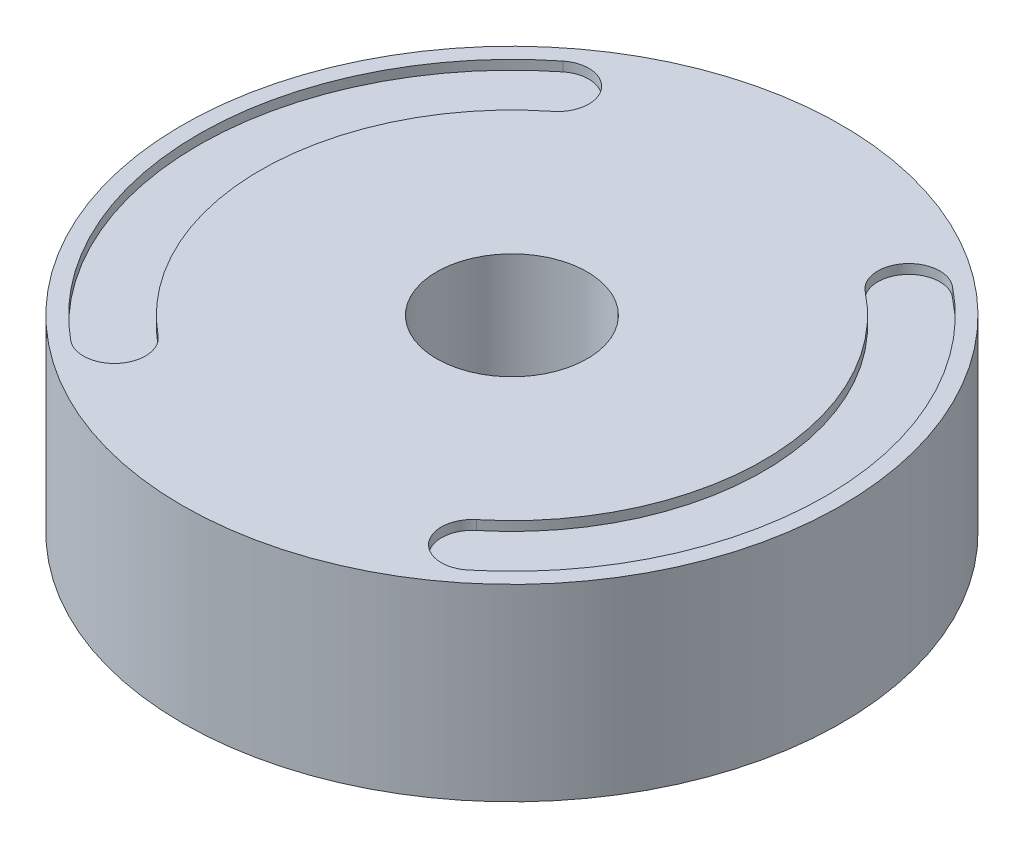
ISO-10303-21;
HEADER;
FILE_DESCRIPTION(('STEP AP214'),'2;1');
FILE_NAME('part.step','',(''),(''),'','','');
FILE_SCHEMA(('AUTOMOTIVE_DESIGN { 1 0 10303 214 1 1 1 1 }'));
ENDSEC;
DATA;
#1=APPLICATION_CONTEXT('core data for automotive mechanical design processes');
#2=APPLICATION_PROTOCOL_DEFINITION('international standard','automotive_design',2000,#1);
#3=PRODUCT_CONTEXT('',#1,'mechanical');
#4=PRODUCT('Part','Part','',(#3));
#5=PRODUCT_RELATED_PRODUCT_CATEGORY('part','',(#4));
#6=PRODUCT_DEFINITION_FORMATION('','',#4);
#7=PRODUCT_DEFINITION_CONTEXT('part definition',#1,'design');
#8=PRODUCT_DEFINITION('design','',#6,#7);
#9=PRODUCT_DEFINITION_SHAPE('','',#8);
#10=(LENGTH_UNIT() NAMED_UNIT(*) SI_UNIT(.MILLI.,.METRE.));
#11=(NAMED_UNIT(*) PLANE_ANGLE_UNIT() SI_UNIT($,.RADIAN.));
#12=(NAMED_UNIT(*) SI_UNIT($,.STERADIAN.) SOLID_ANGLE_UNIT());
#13=UNCERTAINTY_MEASURE_WITH_UNIT(LENGTH_MEASURE(1.E-05),#10,'distance_accuracy_value','');
#14=(GEOMETRIC_REPRESENTATION_CONTEXT(3) GLOBAL_UNCERTAINTY_ASSIGNED_CONTEXT((#13)) GLOBAL_UNIT_ASSIGNED_CONTEXT((#10,
#11,#12)) REPRESENTATION_CONTEXT('',''));
#15=CARTESIAN_POINT('',(0.,0.,0.));
#16=DIRECTION('',(0.,0.,1.));
#17=DIRECTION('',(1.,0.,0.));
#18=AXIS2_PLACEMENT_3D('',#15,#16,#17);
#19=CARTESIAN_POINT('',(-175.,10.,0.));
#20=DIRECTION('',(0.,1.,0.));
#21=DIRECTION('',(0.,0.,1.));
#22=AXIS2_PLACEMENT_3D('',#19,#20,#21);
#23=PLANE('',#22);
#24=CARTESIAN_POINT('',(-184.504576243223,10.,11.6044401173329));
#25=DIRECTION('',(0.,1.,0.));
#26=DIRECTION('',(0.,0.,-1.));
#27=AXIS2_PLACEMENT_3D('',#24,#25,#26);
#28=CIRCLE('',#27,1.64750357806443);
#29=CARTESIAN_POINT('',(-185.548497801136,10.,12.8789972249823));
#30=VERTEX_POINT('',#29);
#31=CARTESIAN_POINT('',(-183.46065468531,10.,10.3298830096836));
#32=VERTEX_POINT('',#31);
#33=EDGE_CURVE('E59',#30,#32,#28,.T.);
#34=ORIENTED_EDGE('',*,*,#33,.F.);
#35=CARTESIAN_POINT('',(-175.,10.,0.));
#36=DIRECTION('',(0.,1.,0.));
#37=DIRECTION('',(0.,0.,-1.));
#38=AXIS2_PLACEMENT_3D('',#35,#36,#37);
#39=CIRCLE('',#38,16.6475035780644);
#40=CARTESIAN_POINT('',(-185.342834196264,10.,-13.0447367229188));
#41=VERTEX_POINT('',#40);
#42=EDGE_CURVE('E145',#41,#30,#39,.T.);
#43=ORIENTED_EDGE('',*,*,#42,.F.);
#44=CARTESIAN_POINT('',(-184.319265931763,10.,-11.7537773712575));
#45=DIRECTION('',(0.,1.,0.));
#46=DIRECTION('',(0.,0.,-1.));
#47=AXIS2_PLACEMENT_3D('',#44,#45,#46);
#48=CIRCLE('',#47,1.64750357806444);
#49=CARTESIAN_POINT('',(-183.295697667262,10.,-10.4628180195962));
#50=VERTEX_POINT('',#49);
#51=EDGE_CURVE('E159',#50,#41,#48,.T.);
#52=ORIENTED_EDGE('',*,*,#51,.F.);
#53=CARTESIAN_POINT('',(-175.,10.,0.));
#54=DIRECTION('',(0.,-1.,0.));
#55=DIRECTION('',(0.,0.,-1.));
#56=AXIS2_PLACEMENT_3D('',#53,#54,#55);
#57=CIRCLE('',#56,13.3524964219356);
#58=EDGE_CURVE('E156',#32,#50,#57,.T.);
#59=ORIENTED_EDGE('',*,*,#58,.F.);
#60=EDGE_LOOP('',(#34,#43,#52,#59));
#61=FACE_BOUND('',#60,.T.);
#62=CARTESIAN_POINT('',(-175.,10.,0.));
#63=DIRECTION('',(0.,1.,0.));
#64=DIRECTION('',(0.,0.,1.));
#65=AXIS2_PLACEMENT_3D('',#62,#63,#64);
#66=CIRCLE('',#65,17.5);
#67=CARTESIAN_POINT('',(-175.,10.,17.5));
#68=VERTEX_POINT('',#67);
#69=EDGE_CURVE('E11',#68,#68,#66,.T.);
#70=ORIENTED_EDGE('',*,*,#69,.T.);
#71=EDGE_LOOP('',(#70));
#72=FACE_BOUND('',#71,.T.);
#73=CARTESIAN_POINT('',(-175.,10.,0.));
#74=DIRECTION('',(0.,1.,0.));
#75=DIRECTION('',(0.,0.,1.));
#76=AXIS2_PLACEMENT_3D('',#73,#74,#75);
#77=CIRCLE('',#76,3.99999999999999);
#78=CARTESIAN_POINT('',(-175.,10.,3.99999999999999));
#79=VERTEX_POINT('',#78);
#80=EDGE_CURVE('E170',#79,#79,#77,.T.);
#81=ORIENTED_EDGE('',*,*,#80,.F.);
#82=EDGE_LOOP('',(#81));
#83=FACE_BOUND('',#82,.T.);
#84=CARTESIAN_POINT('',(-165.495423756777,10.,11.6044401173329));
#85=DIRECTION('',(0.,1.,0.));
#86=DIRECTION('',(0.,0.,1.));
#87=AXIS2_PLACEMENT_3D('',#84,#85,#86);
#88=CIRCLE('',#87,1.64750357806443);
#89=CARTESIAN_POINT('',(-166.53934531469,10.,10.3298830096836));
#90=VERTEX_POINT('',#89);
#91=CARTESIAN_POINT('',(-164.451502198864,10.,12.8789972249823));
#92=VERTEX_POINT('',#91);
#93=EDGE_CURVE('E51',#90,#92,#88,.T.);
#94=ORIENTED_EDGE('',*,*,#93,.F.);
#95=CARTESIAN_POINT('',(-175.,10.,0.));
#96=DIRECTION('',(0.,-1.,0.));
#97=DIRECTION('',(0.,0.,1.));
#98=AXIS2_PLACEMENT_3D('',#95,#96,#97);
#99=CIRCLE('',#98,13.3524964219356);
#100=CARTESIAN_POINT('',(-166.704302332738,10.,-10.4628180195962));
#101=VERTEX_POINT('',#100);
#102=EDGE_CURVE('E121',#101,#90,#99,.T.);
#103=ORIENTED_EDGE('',*,*,#102,.F.);
#104=CARTESIAN_POINT('',(-165.680734068237,10.,-11.7537773712575));
#105=DIRECTION('',(0.,1.,0.));
#106=DIRECTION('',(0.,0.,1.));
#107=AXIS2_PLACEMENT_3D('',#104,#105,#106);
#108=CIRCLE('',#107,1.64750357806444);
#109=CARTESIAN_POINT('',(-164.657165803736,10.,-13.0447367229188));
#110=VERTEX_POINT('',#109);
#111=EDGE_CURVE('E124',#110,#101,#108,.T.);
#112=ORIENTED_EDGE('',*,*,#111,.F.);
#113=CARTESIAN_POINT('',(-175.,10.,0.));
#114=DIRECTION('',(0.,1.,0.));
#115=DIRECTION('',(0.,0.,1.));
#116=AXIS2_PLACEMENT_3D('',#113,#114,#115);
#117=CIRCLE('',#116,16.6475035780644);
#118=EDGE_CURVE('E130',#92,#110,#117,.T.);
#119=ORIENTED_EDGE('',*,*,#118,.F.);
#120=EDGE_LOOP('',(#94,#103,#112,#119));
#121=FACE_BOUND('',#120,.T.);
#122=ADVANCED_FACE('F36',(#61,#72,#83,#121),#23,.T.);
#123=CARTESIAN_POINT('',(-175.,0.,0.));
#124=DIRECTION('',(0.,1.,0.));
#125=DIRECTION('',(0.,0.,1.));
#126=AXIS2_PLACEMENT_3D('',#123,#124,#125);
#127=PLANE('',#126);
#128=CARTESIAN_POINT('',(-175.,0.,0.));
#129=DIRECTION('',(0.,1.,0.));
#130=DIRECTION('',(0.,0.,1.));
#131=AXIS2_PLACEMENT_3D('',#128,#129,#130);
#132=CIRCLE('',#131,17.5);
#133=CARTESIAN_POINT('',(-175.,0.,17.5));
#134=VERTEX_POINT('',#133);
#135=EDGE_CURVE('E40',#134,#134,#132,.T.);
#136=ORIENTED_EDGE('',*,*,#135,.F.);
#137=EDGE_LOOP('',(#136));
#138=FACE_BOUND('',#137,.T.);
#139=CARTESIAN_POINT('',(-175.,0.,0.));
#140=DIRECTION('',(0.,1.,0.));
#141=DIRECTION('',(0.,0.,1.));
#142=AXIS2_PLACEMENT_3D('',#139,#140,#141);
#143=CIRCLE('',#142,3.99999999999999);
#144=CARTESIAN_POINT('',(-175.,0.,3.99999999999999));
#145=VERTEX_POINT('',#144);
#146=EDGE_CURVE('E137',#145,#145,#143,.T.);
#147=ORIENTED_EDGE('',*,*,#146,.T.);
#148=EDGE_LOOP('',(#147));
#149=FACE_BOUND('',#148,.T.);
#150=ADVANCED_FACE('F176',(#138,#149),#127,.F.);
#151=CARTESIAN_POINT('',(-175.,10.,0.));
#152=DIRECTION('',(0.,-1.,0.));
#153=DIRECTION('',(0.,0.,-1.));
#154=AXIS2_PLACEMENT_3D('',#151,#152,#153);
#155=CYLINDRICAL_SURFACE('',#154,17.5);
#156=ORIENTED_EDGE('',*,*,#69,.F.);
#157=EDGE_LOOP('',(#156));
#158=FACE_BOUND('',#157,.T.);
#159=ORIENTED_EDGE('',*,*,#135,.T.);
#160=EDGE_LOOP('',(#159));
#161=FACE_BOUND('',#160,.T.);
#162=ADVANCED_FACE('F38',(#158,#161),#155,.T.);
#163=CARTESIAN_POINT('',(-175.,10.,0.));
#164=DIRECTION('',(0.,-1.,0.));
#165=DIRECTION('',(0.,0.,-1.));
#166=AXIS2_PLACEMENT_3D('',#163,#164,#165);
#167=CYLINDRICAL_SURFACE('',#166,3.99999999999999);
#168=ORIENTED_EDGE('',*,*,#80,.T.);
#169=EDGE_LOOP('',(#168));
#170=FACE_BOUND('',#169,.T.);
#171=ORIENTED_EDGE('',*,*,#146,.F.);
#172=EDGE_LOOP('',(#171));
#173=FACE_BOUND('',#172,.T.);
#174=ADVANCED_FACE('F178',(#170,#173),#167,.F.);
#175=CARTESIAN_POINT('',(-184.504576243223,9.5,11.6044401173329));
#176=DIRECTION('',(0.,1.,0.));
#177=DIRECTION('',(0.,0.,1.));
#178=AXIS2_PLACEMENT_3D('',#175,#176,#177);
#179=CYLINDRICAL_SURFACE('',#178,1.64750357806443);
#180=ORIENTED_EDGE('',*,*,#33,.T.);
#181=DIRECTION('',(0.,1.,0.));
#182=VECTOR('',#181,1.);
#183=CARTESIAN_POINT('',(-183.46065468531,9.5,10.3298830096836));
#184=LINE('',#183,#182);
#185=CARTESIAN_POINT('',(-183.46065468531,9.5,10.3298830096836));
#186=VERTEX_POINT('',#185);
#187=EDGE_CURVE('E154',#186,#32,#184,.T.);
#188=ORIENTED_EDGE('',*,*,#187,.F.);
#189=CARTESIAN_POINT('',(-184.504576243223,9.5,11.6044401173329));
#190=DIRECTION('',(0.,1.,0.));
#191=DIRECTION('',(0.,0.,-1.));
#192=AXIS2_PLACEMENT_3D('',#189,#190,#191);
#193=CIRCLE('',#192,1.64750357806443);
#194=CARTESIAN_POINT('',(-185.548497801136,9.5,12.8789972249823));
#195=VERTEX_POINT('',#194);
#196=EDGE_CURVE('E141',#195,#186,#193,.T.);
#197=ORIENTED_EDGE('',*,*,#196,.F.);
#198=DIRECTION('',(0.,1.,0.));
#199=VECTOR('',#198,1.);
#200=CARTESIAN_POINT('',(-185.548497801136,9.5,12.8789972249823));
#201=LINE('',#200,#199);
#202=EDGE_CURVE('E131',#195,#30,#201,.T.);
#203=ORIENTED_EDGE('',*,*,#202,.T.);
#204=EDGE_LOOP('',(#180,#188,#197,#203));
#205=FACE_BOUND('',#204,.T.);
#206=ADVANCED_FACE('F180',(#205),#179,.F.);
#207=CARTESIAN_POINT('',(-175.,9.5,0.));
#208=DIRECTION('',(0.,1.,0.));
#209=DIRECTION('',(0.,0.,1.));
#210=AXIS2_PLACEMENT_3D('',#207,#208,#209);
#211=CYLINDRICAL_SURFACE('',#210,16.6475035780644);
#212=ORIENTED_EDGE('',*,*,#42,.T.);
#213=ORIENTED_EDGE('',*,*,#202,.F.);
#214=CARTESIAN_POINT('',(-175.,9.5,0.));
#215=DIRECTION('',(0.,1.,0.));
#216=DIRECTION('',(0.,0.,-1.));
#217=AXIS2_PLACEMENT_3D('',#214,#215,#216);
#218=CIRCLE('',#217,16.6475035780644);
#219=CARTESIAN_POINT('',(-185.342834196264,9.5,-13.0447367229188));
#220=VERTEX_POINT('',#219);
#221=EDGE_CURVE('E151',#220,#195,#218,.T.);
#222=ORIENTED_EDGE('',*,*,#221,.F.);
#223=DIRECTION('',(0.,1.,0.));
#224=VECTOR('',#223,1.);
#225=CARTESIAN_POINT('',(-185.342834196264,9.5,-13.0447367229188));
#226=LINE('',#225,#224);
#227=EDGE_CURVE('E165',#220,#41,#226,.T.);
#228=ORIENTED_EDGE('',*,*,#227,.T.);
#229=EDGE_LOOP('',(#212,#213,#222,#228));
#230=FACE_BOUND('',#229,.T.);
#231=ADVANCED_FACE('F187',(#230),#211,.F.);
#232=CARTESIAN_POINT('',(-184.319265931763,9.5,-11.7537773712575));
#233=DIRECTION('',(0.,1.,0.));
#234=DIRECTION('',(0.,0.,1.));
#235=AXIS2_PLACEMENT_3D('',#232,#233,#234);
#236=CYLINDRICAL_SURFACE('',#235,1.64750357806444);
#237=ORIENTED_EDGE('',*,*,#51,.T.);
#238=ORIENTED_EDGE('',*,*,#227,.F.);
#239=CARTESIAN_POINT('',(-184.319265931763,9.5,-11.7537773712575));
#240=DIRECTION('',(0.,1.,0.));
#241=DIRECTION('',(0.,0.,-1.));
#242=AXIS2_PLACEMENT_3D('',#239,#240,#241);
#243=CIRCLE('',#242,1.64750357806444);
#244=CARTESIAN_POINT('',(-183.295697667262,9.5,-10.4628180195962));
#245=VERTEX_POINT('',#244);
#246=EDGE_CURVE('E148',#245,#220,#243,.T.);
#247=ORIENTED_EDGE('',*,*,#246,.F.);
#248=DIRECTION('',(0.,1.,0.));
#249=VECTOR('',#248,1.);
#250=CARTESIAN_POINT('',(-183.295697667262,9.5,-10.4628180195962));
#251=LINE('',#250,#249);
#252=EDGE_CURVE('E167',#245,#50,#251,.T.);
#253=ORIENTED_EDGE('',*,*,#252,.T.);
#254=EDGE_LOOP('',(#237,#238,#247,#253));
#255=FACE_BOUND('',#254,.T.);
#256=ADVANCED_FACE('F229',(#255),#236,.F.);
#257=CARTESIAN_POINT('',(-175.,9.5,0.));
#258=DIRECTION('',(0.,1.,0.));
#259=DIRECTION('',(0.,0.,1.));
#260=AXIS2_PLACEMENT_3D('',#257,#258,#259);
#261=CYLINDRICAL_SURFACE('',#260,13.3524964219356);
#262=ORIENTED_EDGE('',*,*,#58,.T.);
#263=ORIENTED_EDGE('',*,*,#252,.F.);
#264=CARTESIAN_POINT('',(-175.,9.5,0.));
#265=DIRECTION('',(0.,-1.,0.));
#266=DIRECTION('',(0.,0.,-1.));
#267=AXIS2_PLACEMENT_3D('',#264,#265,#266);
#268=CIRCLE('',#267,13.3524964219356);
#269=EDGE_CURVE('E144',#186,#245,#268,.T.);
#270=ORIENTED_EDGE('',*,*,#269,.F.);
#271=ORIENTED_EDGE('',*,*,#187,.T.);
#272=EDGE_LOOP('',(#262,#263,#270,#271));
#273=FACE_BOUND('',#272,.T.);
#274=ADVANCED_FACE('F225',(#273),#261,.T.);
#275=CARTESIAN_POINT('',(-179.752288121611,9.5,5.80222005866646));
#276=DIRECTION('',(0.,-1.,0.));
#277=DIRECTION('',(0.,0.,-1.));
#278=AXIS2_PLACEMENT_3D('',#275,#276,#277);
#279=PLANE('',#278);
#280=ORIENTED_EDGE('',*,*,#196,.T.);
#281=ORIENTED_EDGE('',*,*,#269,.T.);
#282=ORIENTED_EDGE('',*,*,#246,.T.);
#283=ORIENTED_EDGE('',*,*,#221,.T.);
#284=EDGE_LOOP('',(#280,#281,#282,#283));
#285=FACE_BOUND('',#284,.T.);
#286=ADVANCED_FACE('F217',(#285),#279,.F.);
#287=CARTESIAN_POINT('',(-165.495423756777,9.5,11.6044401173329));
#288=DIRECTION('',(0.,1.,0.));
#289=DIRECTION('',(0.,0.,1.));
#290=AXIS2_PLACEMENT_3D('',#287,#288,#289);
#291=CYLINDRICAL_SURFACE('',#290,1.64750357806443);
#292=ORIENTED_EDGE('',*,*,#93,.T.);
#293=DIRECTION('',(0.,1.,0.));
#294=VECTOR('',#293,1.);
#295=CARTESIAN_POINT('',(-164.451502198864,9.5,12.8789972249823));
#296=LINE('',#295,#294);
#297=CARTESIAN_POINT('',(-164.451502198864,9.5,12.8789972249823));
#298=VERTEX_POINT('',#297);
#299=EDGE_CURVE('E99',#298,#92,#296,.T.);
#300=ORIENTED_EDGE('',*,*,#299,.F.);
#301=CARTESIAN_POINT('',(-165.495423756777,9.5,11.6044401173329));
#302=DIRECTION('',(0.,1.,0.));
#303=DIRECTION('',(0.,0.,1.));
#304=AXIS2_PLACEMENT_3D('',#301,#302,#303);
#305=CIRCLE('',#304,1.64750357806443);
#306=CARTESIAN_POINT('',(-166.53934531469,9.5,10.3298830096836));
#307=VERTEX_POINT('',#306);
#308=EDGE_CURVE('E103',#307,#298,#305,.T.);
#309=ORIENTED_EDGE('',*,*,#308,.F.);
#310=DIRECTION('',(0.,1.,0.));
#311=VECTOR('',#310,1.);
#312=CARTESIAN_POINT('',(-166.53934531469,9.5,10.3298830096836));
#313=LINE('',#312,#311);
#314=EDGE_CURVE('E135',#307,#90,#313,.T.);
#315=ORIENTED_EDGE('',*,*,#314,.T.);
#316=EDGE_LOOP('',(#292,#300,#309,#315));
#317=FACE_BOUND('',#316,.T.);
#318=ADVANCED_FACE('F101',(#317),#291,.F.);
#319=CARTESIAN_POINT('',(-175.,9.5,0.));
#320=DIRECTION('',(0.,1.,0.));
#321=DIRECTION('',(0.,0.,1.));
#322=AXIS2_PLACEMENT_3D('',#319,#320,#321);
#323=CYLINDRICAL_SURFACE('',#322,13.3524964219356);
#324=ORIENTED_EDGE('',*,*,#102,.T.);
#325=ORIENTED_EDGE('',*,*,#314,.F.);
#326=CARTESIAN_POINT('',(-175.,9.5,0.));
#327=DIRECTION('',(0.,-1.,0.));
#328=DIRECTION('',(0.,0.,1.));
#329=AXIS2_PLACEMENT_3D('',#326,#327,#328);
#330=CIRCLE('',#329,13.3524964219356);
#331=CARTESIAN_POINT('',(-166.704302332738,9.5,-10.4628180195962));
#332=VERTEX_POINT('',#331);
#333=EDGE_CURVE('E109',#332,#307,#330,.T.);
#334=ORIENTED_EDGE('',*,*,#333,.F.);
#335=DIRECTION('',(0.,1.,0.));
#336=VECTOR('',#335,1.);
#337=CARTESIAN_POINT('',(-166.704302332738,9.5,-10.4628180195962));
#338=LINE('',#337,#336);
#339=EDGE_CURVE('E138',#332,#101,#338,.T.);
#340=ORIENTED_EDGE('',*,*,#339,.T.);
#341=EDGE_LOOP('',(#324,#325,#334,#340));
#342=FACE_BOUND('',#341,.T.);
#343=ADVANCED_FACE('F209',(#342),#323,.T.);
#344=CARTESIAN_POINT('',(-165.680734068237,9.5,-11.7537773712575));
#345=DIRECTION('',(0.,1.,0.));
#346=DIRECTION('',(0.,0.,1.));
#347=AXIS2_PLACEMENT_3D('',#344,#345,#346);
#348=CYLINDRICAL_SURFACE('',#347,1.64750357806444);
#349=ORIENTED_EDGE('',*,*,#111,.T.);
#350=ORIENTED_EDGE('',*,*,#339,.F.);
#351=CARTESIAN_POINT('',(-165.680734068237,9.5,-11.7537773712575));
#352=DIRECTION('',(0.,1.,0.));
#353=DIRECTION('',(0.,0.,1.));
#354=AXIS2_PLACEMENT_3D('',#351,#352,#353);
#355=CIRCLE('',#354,1.64750357806444);
#356=CARTESIAN_POINT('',(-164.657165803736,9.5,-13.0447367229188));
#357=VERTEX_POINT('',#356);
#358=EDGE_CURVE('E117',#357,#332,#355,.T.);
#359=ORIENTED_EDGE('',*,*,#358,.F.);
#360=DIRECTION('',(0.,1.,0.));
#361=VECTOR('',#360,1.);
#362=CARTESIAN_POINT('',(-164.657165803736,9.5,-13.0447367229188));
#363=LINE('',#362,#361);
#364=EDGE_CURVE('E108',#357,#110,#363,.T.);
#365=ORIENTED_EDGE('',*,*,#364,.T.);
#366=EDGE_LOOP('',(#349,#350,#359,#365));
#367=FACE_BOUND('',#366,.T.);
#368=ADVANCED_FACE('F207',(#367),#348,.F.);
#369=CARTESIAN_POINT('',(-175.,9.5,0.));
#370=DIRECTION('',(0.,1.,0.));
#371=DIRECTION('',(0.,0.,1.));
#372=AXIS2_PLACEMENT_3D('',#369,#370,#371);
#373=CYLINDRICAL_SURFACE('',#372,16.6475035780644);
#374=ORIENTED_EDGE('',*,*,#118,.T.);
#375=ORIENTED_EDGE('',*,*,#364,.F.);
#376=CARTESIAN_POINT('',(-175.,9.5,0.));
#377=DIRECTION('',(0.,1.,0.));
#378=DIRECTION('',(0.,0.,1.));
#379=AXIS2_PLACEMENT_3D('',#376,#377,#378);
#380=CIRCLE('',#379,16.6475035780644);
#381=EDGE_CURVE('E112',#298,#357,#380,.T.);
#382=ORIENTED_EDGE('',*,*,#381,.F.);
#383=ORIENTED_EDGE('',*,*,#299,.T.);
#384=EDGE_LOOP('',(#374,#375,#382,#383));
#385=FACE_BOUND('',#384,.T.);
#386=ADVANCED_FACE('F113',(#385),#373,.F.);
#387=CARTESIAN_POINT('',(-170.247711878389,9.5,5.80222005866646));
#388=DIRECTION('',(0.,1.,0.));
#389=DIRECTION('',(0.,0.,1.));
#390=AXIS2_PLACEMENT_3D('',#387,#388,#389);
#391=PLANE('',#390);
#392=ORIENTED_EDGE('',*,*,#308,.T.);
#393=ORIENTED_EDGE('',*,*,#381,.T.);
#394=ORIENTED_EDGE('',*,*,#358,.T.);
#395=ORIENTED_EDGE('',*,*,#333,.T.);
#396=EDGE_LOOP('',(#392,#393,#394,#395));
#397=FACE_BOUND('',#396,.T.);
#398=ADVANCED_FACE('F119',(#397),#391,.T.);
#399=CLOSED_SHELL('',(#122,#150,#162,#174,#206,#231,#256,#274,#286,#318,#343,#368,#386,#398));
#400=MANIFOLD_SOLID_BREP('B2',#399);
#401=ADVANCED_BREP_SHAPE_REPRESENTATION('',(#18,#400),#14);
#402=SHAPE_DEFINITION_REPRESENTATION(#9,#401);
ENDSEC;
END-ISO-10303-21;
